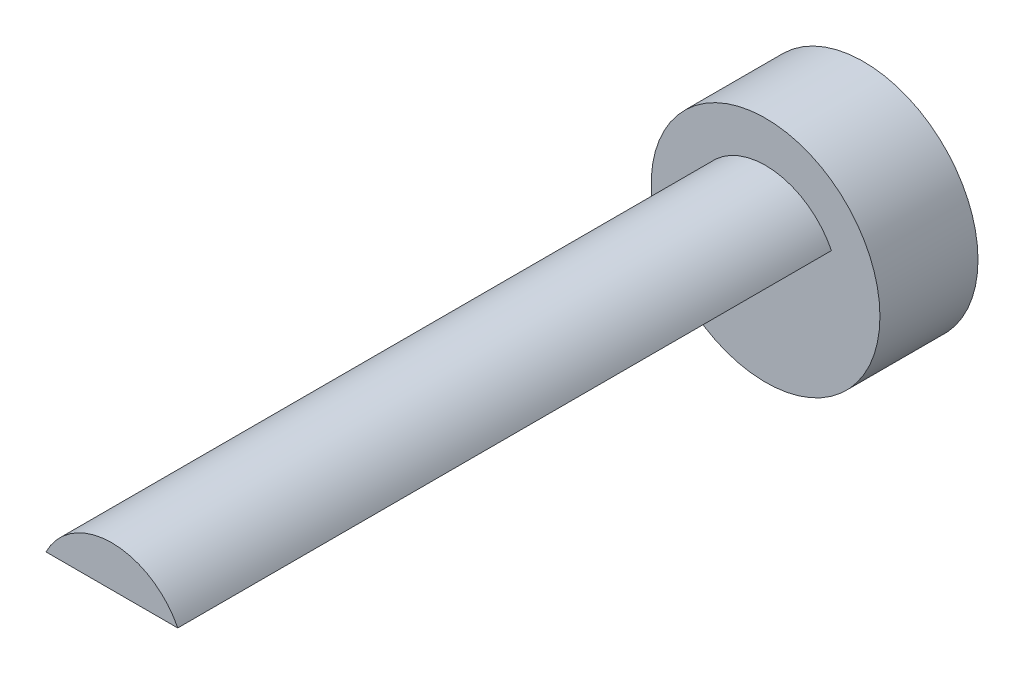
ISO-10303-21;
HEADER;
FILE_DESCRIPTION(('STEP AP214'),'2;1');
FILE_NAME('part.step','',(''),(''),'','','');
FILE_SCHEMA(('AUTOMOTIVE_DESIGN { 1 0 10303 214 1 1 1 1 }'));
ENDSEC;
DATA;
#1=APPLICATION_CONTEXT('core data for automotive mechanical design processes');
#2=APPLICATION_PROTOCOL_DEFINITION('international standard','automotive_design',2000,#1);
#3=PRODUCT_CONTEXT('',#1,'mechanical');
#4=PRODUCT('Part','Part','',(#3));
#5=PRODUCT_RELATED_PRODUCT_CATEGORY('part','',(#4));
#6=PRODUCT_DEFINITION_FORMATION('','',#4);
#7=PRODUCT_DEFINITION_CONTEXT('part definition',#1,'design');
#8=PRODUCT_DEFINITION('design','',#6,#7);
#9=PRODUCT_DEFINITION_SHAPE('','',#8);
#10=(LENGTH_UNIT() NAMED_UNIT(*) SI_UNIT(.MILLI.,.METRE.));
#11=(NAMED_UNIT(*) PLANE_ANGLE_UNIT() SI_UNIT($,.RADIAN.));
#12=(NAMED_UNIT(*) SI_UNIT($,.STERADIAN.) SOLID_ANGLE_UNIT());
#13=UNCERTAINTY_MEASURE_WITH_UNIT(LENGTH_MEASURE(1.E-05),#10,'distance_accuracy_value','');
#14=(GEOMETRIC_REPRESENTATION_CONTEXT(3) GLOBAL_UNCERTAINTY_ASSIGNED_CONTEXT((#13)) GLOBAL_UNIT_ASSIGNED_CONTEXT((#10,
#11,#12)) REPRESENTATION_CONTEXT('',''));
#15=CARTESIAN_POINT('',(0.,0.,0.));
#16=DIRECTION('',(0.,0.,1.));
#17=DIRECTION('',(1.,0.,0.));
#18=AXIS2_PLACEMENT_3D('',#15,#16,#17);
#19=CARTESIAN_POINT('',(0.,0.,0.));
#20=DIRECTION('',(0.,0.,1.));
#21=DIRECTION('',(1.,0.,0.));
#22=AXIS2_PLACEMENT_3D('',#19,#20,#21);
#23=PLANE('',#22);
#24=CARTESIAN_POINT('',(0.,0.,0.));
#25=DIRECTION('',(0.,0.,1.));
#26=DIRECTION('',(1.,0.,0.));
#27=AXIS2_PLACEMENT_3D('',#24,#25,#26);
#28=CIRCLE('',#27,3.5);
#29=CARTESIAN_POINT('',(3.5,0.,0.));
#30=VERTEX_POINT('',#29);
#31=EDGE_CURVE('E52',#30,#30,#28,.T.);
#32=ORIENTED_EDGE('',*,*,#31,.F.);
#33=EDGE_LOOP('',(#32));
#34=FACE_BOUND('',#33,.T.);
#35=ADVANCED_FACE('F48',(#34),#23,.F.);
#36=CARTESIAN_POINT('',(0.,0.,3.));
#37=DIRECTION('',(0.,0.,-1.));
#38=DIRECTION('',(-1.,0.,0.));
#39=AXIS2_PLACEMENT_3D('',#36,#37,#38);
#40=CYLINDRICAL_SURFACE('',#39,3.5);
#41=ORIENTED_EDGE('',*,*,#31,.T.);
#42=EDGE_LOOP('',(#41));
#43=FACE_BOUND('',#42,.T.);
#44=CARTESIAN_POINT('',(0.,0.,3.));
#45=DIRECTION('',(0.,0.,1.));
#46=DIRECTION('',(1.,0.,0.));
#47=AXIS2_PLACEMENT_3D('',#44,#45,#46);
#48=CIRCLE('',#47,3.5);
#49=CARTESIAN_POINT('',(3.5,0.,3.));
#50=VERTEX_POINT('',#49);
#51=EDGE_CURVE('E12',#50,#50,#48,.T.);
#52=ORIENTED_EDGE('',*,*,#51,.F.);
#53=EDGE_LOOP('',(#52));
#54=FACE_BOUND('',#53,.T.);
#55=ADVANCED_FACE('F50',(#43,#54),#40,.T.);
#56=CARTESIAN_POINT('',(0.,0.,3.));
#57=DIRECTION('',(0.,0.,1.));
#58=DIRECTION('',(1.,0.,0.));
#59=AXIS2_PLACEMENT_3D('',#56,#57,#58);
#60=PLANE('',#59);
#61=CARTESIAN_POINT('',(0.,0.,3.));
#62=DIRECTION('',(0.,0.,1.));
#63=DIRECTION('',(1.,0.,0.));
#64=AXIS2_PLACEMENT_3D('',#61,#62,#63);
#65=CIRCLE('',#64,2.25);
#66=CARTESIAN_POINT('',(2.01556443707464,1.,3.));
#67=VERTEX_POINT('',#66);
#68=CARTESIAN_POINT('',(-2.01556443707464,1.,3.));
#69=VERTEX_POINT('',#68);
#70=EDGE_CURVE('E78',#67,#69,#65,.T.);
#71=ORIENTED_EDGE('',*,*,#70,.F.);
#72=DIRECTION('',(1.,0.,0.));
#73=VECTOR('',#72,1.);
#74=CARTESIAN_POINT('',(0.,1.,3.));
#75=LINE('',#74,#73);
#76=EDGE_CURVE('E63',#69,#67,#75,.T.);
#77=ORIENTED_EDGE('',*,*,#76,.F.);
#78=EDGE_LOOP('',(#71,#77));
#79=FACE_BOUND('',#78,.T.);
#80=ORIENTED_EDGE('',*,*,#51,.T.);
#81=EDGE_LOOP('',(#80));
#82=FACE_BOUND('',#81,.T.);
#83=ADVANCED_FACE('F88',(#79,#82),#60,.T.);
#84=CARTESIAN_POINT('',(0.,1.,23.));
#85=DIRECTION('',(0.,1.,0.));
#86=DIRECTION('',(0.,0.,1.));
#87=AXIS2_PLACEMENT_3D('',#84,#85,#86);
#88=PLANE('',#87);
#89=ORIENTED_EDGE('',*,*,#76,.T.);
#90=DIRECTION('',(0.,0.,-1.));
#91=VECTOR('',#90,1.);
#92=CARTESIAN_POINT('',(2.01556443707464,1.,23.));
#93=LINE('',#92,#91);
#94=CARTESIAN_POINT('',(2.01556443707464,1.,23.));
#95=VERTEX_POINT('',#94);
#96=EDGE_CURVE('E82',#95,#67,#93,.T.);
#97=ORIENTED_EDGE('',*,*,#96,.F.);
#98=DIRECTION('',(1.,0.,0.));
#99=VECTOR('',#98,1.);
#100=CARTESIAN_POINT('',(0.,1.,23.));
#101=LINE('',#100,#99);
#102=CARTESIAN_POINT('',(-2.01556443707464,1.,23.));
#103=VERTEX_POINT('',#102);
#104=EDGE_CURVE('E84',#103,#95,#101,.T.);
#105=ORIENTED_EDGE('',*,*,#104,.F.);
#106=DIRECTION('',(0.,0.,-1.));
#107=VECTOR('',#106,1.);
#108=CARTESIAN_POINT('',(-2.01556443707464,1.,23.));
#109=LINE('',#108,#107);
#110=EDGE_CURVE('E80',#103,#69,#109,.T.);
#111=ORIENTED_EDGE('',*,*,#110,.T.);
#112=EDGE_LOOP('',(#89,#97,#105,#111));
#113=FACE_BOUND('',#112,.T.);
#114=ADVANCED_FACE('F86',(#113),#88,.F.);
#115=CARTESIAN_POINT('',(0.,0.,23.));
#116=DIRECTION('',(0.,0.,-1.));
#117=DIRECTION('',(-1.,0.,0.));
#118=AXIS2_PLACEMENT_3D('',#115,#116,#117);
#119=CYLINDRICAL_SURFACE('',#118,2.25);
#120=ORIENTED_EDGE('',*,*,#70,.T.);
#121=ORIENTED_EDGE('',*,*,#110,.F.);
#122=CARTESIAN_POINT('',(0.,0.,23.));
#123=DIRECTION('',(0.,0.,1.));
#124=DIRECTION('',(1.,0.,0.));
#125=AXIS2_PLACEMENT_3D('',#122,#123,#124);
#126=CIRCLE('',#125,2.25);
#127=EDGE_CURVE('E71',#95,#103,#126,.T.);
#128=ORIENTED_EDGE('',*,*,#127,.F.);
#129=ORIENTED_EDGE('',*,*,#96,.T.);
#130=EDGE_LOOP('',(#120,#121,#128,#129));
#131=FACE_BOUND('',#130,.T.);
#132=ADVANCED_FACE('F79',(#131),#119,.T.);
#133=CARTESIAN_POINT('',(0.,0.,23.));
#134=DIRECTION('',(0.,0.,1.));
#135=DIRECTION('',(1.,0.,0.));
#136=AXIS2_PLACEMENT_3D('',#133,#134,#135);
#137=PLANE('',#136);
#138=ORIENTED_EDGE('',*,*,#104,.T.);
#139=ORIENTED_EDGE('',*,*,#127,.T.);
#140=EDGE_LOOP('',(#138,#139));
#141=FACE_BOUND('',#140,.T.);
#142=ADVANCED_FACE('F112',(#141),#137,.T.);
#143=CLOSED_SHELL('',(#35,#55,#83,#114,#132,#142));
#144=MANIFOLD_SOLID_BREP('B2',#143);
#145=ADVANCED_BREP_SHAPE_REPRESENTATION('',(#18,#144),#14);
#146=SHAPE_DEFINITION_REPRESENTATION(#9,#145);
ENDSEC;
END-ISO-10303-21;
